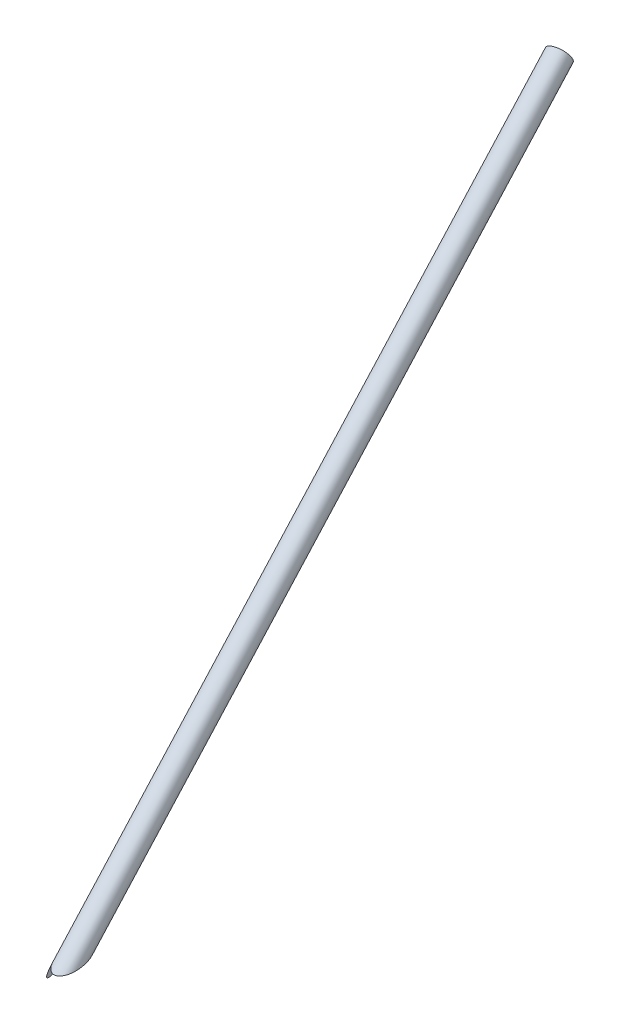
ISO-10303-21;
HEADER;
FILE_DESCRIPTION(('STEP AP214'),'2;1');
FILE_NAME('part.step','',(''),(''),'','','');
FILE_SCHEMA(('AUTOMOTIVE_DESIGN { 1 0 10303 214 1 1 1 1 }'));
ENDSEC;
DATA;
#1=APPLICATION_CONTEXT('core data for automotive mechanical design processes');
#2=APPLICATION_PROTOCOL_DEFINITION('international standard','automotive_design',2000,#1);
#3=PRODUCT_CONTEXT('',#1,'mechanical');
#4=PRODUCT('Part','Part','',(#3));
#5=PRODUCT_RELATED_PRODUCT_CATEGORY('part','',(#4));
#6=PRODUCT_DEFINITION_FORMATION('','',#4);
#7=PRODUCT_DEFINITION_CONTEXT('part definition',#1,'design');
#8=PRODUCT_DEFINITION('design','',#6,#7);
#9=PRODUCT_DEFINITION_SHAPE('','',#8);
#10=(LENGTH_UNIT() NAMED_UNIT(*) SI_UNIT(.MILLI.,.METRE.));
#11=(NAMED_UNIT(*) PLANE_ANGLE_UNIT() SI_UNIT($,.RADIAN.));
#12=(NAMED_UNIT(*) SI_UNIT($,.STERADIAN.) SOLID_ANGLE_UNIT());
#13=UNCERTAINTY_MEASURE_WITH_UNIT(LENGTH_MEASURE(1.E-05),#10,'distance_accuracy_value','');
#14=(GEOMETRIC_REPRESENTATION_CONTEXT(3) GLOBAL_UNCERTAINTY_ASSIGNED_CONTEXT((#13)) GLOBAL_UNIT_ASSIGNED_CONTEXT((#10,
#11,#12)) REPRESENTATION_CONTEXT('',''));
#15=CARTESIAN_POINT('',(0.,0.,0.));
#16=DIRECTION('',(0.,0.,1.));
#17=DIRECTION('',(1.,0.,0.));
#18=AXIS2_PLACEMENT_3D('',#15,#16,#17);
#19=CARTESIAN_POINT('',(-325.,320.000000000001,-1580.));
#20=DIRECTION('',(0.227207840964845,-0.4673512982197,0.85437659205789));
#21=DIRECTION('',(0.,-0.877321812102288,-0.479902529696977));
#22=AXIS2_PLACEMENT_3D('',#19,#20,#21);
#23=CYLINDRICAL_SURFACE('',#22,7.90000000000002);
#24=CARTESIAN_POINT('',(-174.290178571428,10.,-1013.28125));
#25=DIRECTION('',(0.,-1.,0.));
#26=DIRECTION('',(0.257001600590801,0.,0.96641097742822));
#27=AXIS2_PLACEMENT_3D('',#24,#25,#26);
#28=ELLIPSE('',#27,16.9037724514595,7.90000000000002);
#29=CARTESIAN_POINT('',(-182.747352986209,10.,-1023.46976386029));
#30=VERTEX_POINT('',#29);
#31=CARTESIAN_POINT('',(-181.018883246264,10.,-1008.34565363577));
#32=VERTEX_POINT('',#31);
#33=EDGE_CURVE('E58',#30,#32,#28,.T.);
#34=ORIENTED_EDGE('',*,*,#33,.T.);
#35=CARTESIAN_POINT('',(-187.078954115204,36.3056540110732,-1061.37127373899));
#36=DIRECTION('',(0.993532672656404,0.,-0.113546591160732));
#37=DIRECTION('',(0.100146707762877,-0.471272242379786,0.876283692925177));
#38=AXIS2_PLACEMENT_3D('',#35,#36,#37);
#39=ELLIPSE('',#38,61.3702514104559,7.90000000000002);
#40=EDGE_CURVE('E83',#32,#30,#39,.T.);
#41=ORIENTED_EDGE('',*,*,#40,.T.);
#42=EDGE_LOOP('',(#34,#41));
#43=FACE_BOUND('',#42,.T.);
#44=CARTESIAN_POINT('',(-325.,320.000000000001,-1580.));
#45=DIRECTION('',(-0.227207840964845,0.4673512982197,-0.85437659205789));
#46=DIRECTION('',(0.607006832841848,-0.618080420232195,-0.499519067713037));
#47=AXIS2_PLACEMENT_3D('',#44,#45,#46);
#48=CIRCLE('',#47,7.90000000000002);
#49=CARTESIAN_POINT('',(-320.204646020549,315.117164680166,-1583.94620063493));
#50=VERTEX_POINT('',#49);
#51=EDGE_CURVE('E45',#50,#50,#48,.T.);
#52=ORIENTED_EDGE('',*,*,#51,.T.);
#53=EDGE_LOOP('',(#52));
#54=FACE_BOUND('',#53,.T.);
#55=ADVANCED_FACE('F41',(#43,#54),#23,.F.);
#56=CARTESIAN_POINT('',(-325.,320.000000000001,-1580.));
#57=DIRECTION('',(0.227207840964845,-0.4673512982197,0.85437659205789));
#58=DIRECTION('',(0.,-0.877321812102288,-0.479902529696977));
#59=AXIS2_PLACEMENT_3D('',#56,#57,#58);
#60=CYLINDRICAL_SURFACE('',#59,9.49999999999999);
#61=CARTESIAN_POINT('',(-187.078954115204,36.3056540110732,-1061.37127373899));
#62=DIRECTION('',(0.993532672656404,0.,-0.113546591160732));
#63=DIRECTION('',(0.100146707762877,-0.471272242379786,0.876283692925177));
#64=AXIS2_PLACEMENT_3D('',#61,#62,#63);
#65=ELLIPSE('',#64,73.7996694176366,9.49999999999999);
#66=CARTESIAN_POINT('',(-180.375016784296,10.,-1002.71182209354));
#67=VERTEX_POINT('',#66);
#68=CARTESIAN_POINT('',(-183.391219448178,10.,-1029.10359540251));
#69=VERTEX_POINT('',#68);
#70=EDGE_CURVE('E74',#67,#69,#65,.T.);
#71=ORIENTED_EDGE('',*,*,#70,.F.);
#72=CARTESIAN_POINT('',(-174.290178571428,10.,-1013.28125));
#73=DIRECTION('',(0.,-1.,0.));
#74=DIRECTION('',(0.257001600590801,0.,0.96641097742822));
#75=AXIS2_PLACEMENT_3D('',#72,#73,#74);
#76=ELLIPSE('',#75,20.327321302388,9.49999999999999);
#77=EDGE_CURVE('E71',#69,#67,#76,.T.);
#78=ORIENTED_EDGE('',*,*,#77,.F.);
#79=EDGE_LOOP('',(#71,#78));
#80=FACE_BOUND('',#79,.T.);
#81=CARTESIAN_POINT('',(-325.,320.000000000001,-1580.));
#82=DIRECTION('',(-0.227207840964845,0.4673512982197,-0.85437659205789));
#83=DIRECTION('',(0.,0.877321812102288,0.479902529696977));
#84=AXIS2_PLACEMENT_3D('',#81,#82,#83);
#85=CIRCLE('',#84,9.49999999999999);
#86=CARTESIAN_POINT('',(-325.,328.334557214972,-1575.44092596788));
#87=VERTEX_POINT('',#86);
#88=EDGE_CURVE('E11',#87,#87,#85,.T.);
#89=ORIENTED_EDGE('',*,*,#88,.F.);
#90=EDGE_LOOP('',(#89));
#91=FACE_BOUND('',#90,.T.);
#92=ADVANCED_FACE('F79',(#80,#91),#60,.T.);
#93=CARTESIAN_POINT('',(-259.935326726564,10.,-1698.86453408839));
#94=DIRECTION('',(0.,-1.,0.));
#95=DIRECTION('',(0.,0.,-1.));
#96=AXIS2_PLACEMENT_3D('',#93,#94,#95);
#97=PLANE('',#96);
#98=DIRECTION('',(0.113546591160732,0.,0.993532672656404));
#99=VECTOR('',#98,1.);
#100=CARTESIAN_POINT('',(-259.935326726564,10.,-1698.86453408839));
#101=LINE('',#100,#99);
#102=EDGE_CURVE('E50',#69,#30,#101,.T.);
#103=ORIENTED_EDGE('',*,*,#102,.F.);
#104=ORIENTED_EDGE('',*,*,#77,.T.);
#105=EDGE_CURVE('E64',#32,#67,#101,.T.);
#106=ORIENTED_EDGE('',*,*,#105,.F.);
#107=ORIENTED_EDGE('',*,*,#33,.F.);
#108=EDGE_LOOP('',(#103,#104,#106,#107));
#109=FACE_BOUND('',#108,.T.);
#110=ADVANCED_FACE('F69',(#109),#97,.T.);
#111=CARTESIAN_POINT('',(-259.935326726564,-10.,-1698.86453408839));
#112=DIRECTION('',(0.993532672656404,0.,-0.113546591160732));
#113=DIRECTION('',(-0.113546591160732,0.,-0.993532672656404));
#114=AXIS2_PLACEMENT_3D('',#111,#112,#113);
#115=PLANE('',#114);
#116=ORIENTED_EDGE('',*,*,#105,.T.);
#117=ORIENTED_EDGE('',*,*,#70,.T.);
#118=ORIENTED_EDGE('',*,*,#102,.T.);
#119=ORIENTED_EDGE('',*,*,#40,.F.);
#120=EDGE_LOOP('',(#116,#117,#118,#119));
#121=FACE_BOUND('',#120,.T.);
#122=ADVANCED_FACE('F76',(#121),#115,.T.);
#123=CARTESIAN_POINT('',(-325.,320.000000000001,-1580.));
#124=DIRECTION('',(-0.227207840964845,0.4673512982197,-0.85437659205789));
#125=DIRECTION('',(0.607006832841848,-0.618080420232195,-0.499519067713037));
#126=AXIS2_PLACEMENT_3D('',#123,#124,#125);
#127=PLANE('',#126);
#128=ORIENTED_EDGE('',*,*,#51,.F.);
#129=EDGE_LOOP('',(#128));
#130=FACE_BOUND('',#129,.T.);
#131=ORIENTED_EDGE('',*,*,#88,.T.);
#132=EDGE_LOOP('',(#131));
#133=FACE_BOUND('',#132,.T.);
#134=ADVANCED_FACE('F43',(#130,#133),#127,.T.);
#135=CLOSED_SHELL('',(#55,#92,#110,#122,#134));
#136=MANIFOLD_SOLID_BREP('B2',#135);
#137=ADVANCED_BREP_SHAPE_REPRESENTATION('',(#18,#136),#14);
#138=SHAPE_DEFINITION_REPRESENTATION(#9,#137);
ENDSEC;
END-ISO-10303-21;
